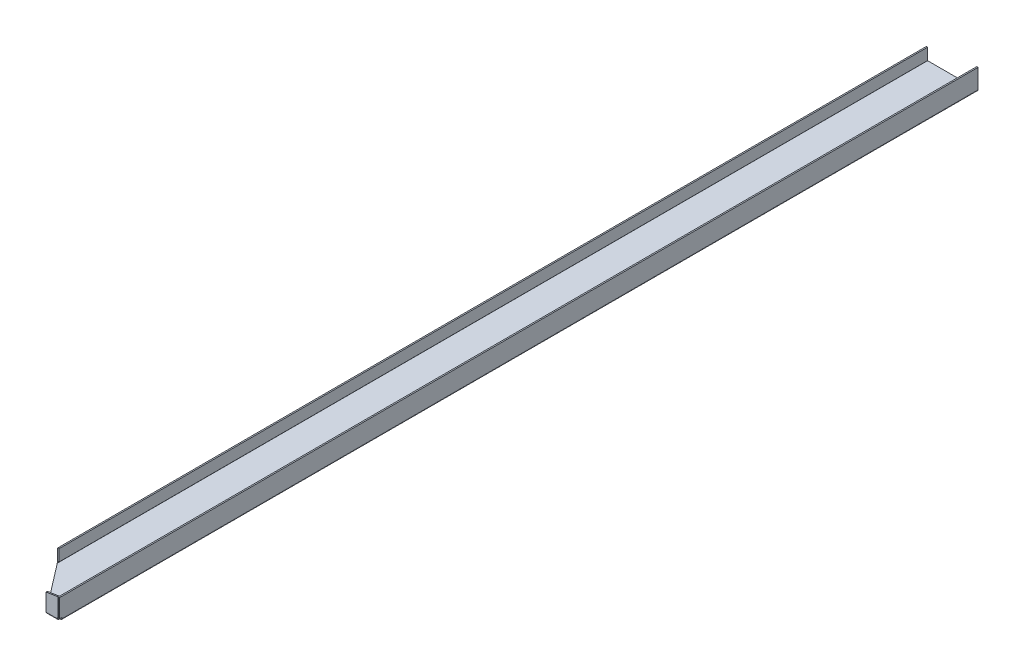
ISO-10303-21;
HEADER;
FILE_DESCRIPTION(('STEP AP214'),'2;1');
FILE_NAME('part.step','',(''),(''),'','','');
FILE_SCHEMA(('AUTOMOTIVE_DESIGN { 1 0 10303 214 1 1 1 1 }'));
ENDSEC;
DATA;
#1=APPLICATION_CONTEXT('core data for automotive mechanical design processes');
#2=APPLICATION_PROTOCOL_DEFINITION('international standard','automotive_design',2000,#1);
#3=PRODUCT_CONTEXT('',#1,'mechanical');
#4=PRODUCT('Part','Part','',(#3));
#5=PRODUCT_RELATED_PRODUCT_CATEGORY('part','',(#4));
#6=PRODUCT_DEFINITION_FORMATION('','',#4);
#7=PRODUCT_DEFINITION_CONTEXT('part definition',#1,'design');
#8=PRODUCT_DEFINITION('design','',#6,#7);
#9=PRODUCT_DEFINITION_SHAPE('','',#8);
#10=(LENGTH_UNIT() NAMED_UNIT(*) SI_UNIT(.MILLI.,.METRE.));
#11=(NAMED_UNIT(*) PLANE_ANGLE_UNIT() SI_UNIT($,.RADIAN.));
#12=(NAMED_UNIT(*) SI_UNIT($,.STERADIAN.) SOLID_ANGLE_UNIT());
#13=UNCERTAINTY_MEASURE_WITH_UNIT(LENGTH_MEASURE(1.E-05),#10,'distance_accuracy_value','');
#14=(GEOMETRIC_REPRESENTATION_CONTEXT(3) GLOBAL_UNCERTAINTY_ASSIGNED_CONTEXT((#13)) GLOBAL_UNIT_ASSIGNED_CONTEXT((#10,
#11,#12)) REPRESENTATION_CONTEXT('',''));
#15=CARTESIAN_POINT('',(0.,0.,0.));
#16=DIRECTION('',(0.,0.,1.));
#17=DIRECTION('',(1.,0.,0.));
#18=AXIS2_PLACEMENT_3D('',#15,#16,#17);
#19=CARTESIAN_POINT('',(137.6,-94.9521229518905,410.229299937073));
#20=DIRECTION('',(1.,0.,0.));
#21=DIRECTION('',(0.,-1.,0.));
#22=AXIS2_PLACEMENT_3D('',#19,#20,#21);
#23=PLANE('',#22);
#24=DIRECTION('',(0.,1.,0.));
#25=VECTOR('',#24,1.);
#26=CARTESIAN_POINT('',(137.6,-115.982008995502,480.));
#27=LINE('',#26,#25);
#28=CARTESIAN_POINT('',(137.6,-144.476011994003,480.));
#29=VERTEX_POINT('',#28);
#30=CARTESIAN_POINT('',(137.6,-116.341829085457,480.));
#31=VERTEX_POINT('',#30);
#32=EDGE_CURVE('E100',#29,#31,#27,.T.);
#33=ORIENTED_EDGE('',*,*,#32,.F.);
#34=DIRECTION('',(0.,0.,1.));
#35=VECTOR('',#34,1.);
#36=CARTESIAN_POINT('',(137.6,-144.476011994003,410.229299937073));
#37=LINE('',#36,#35);
#38=CARTESIAN_POINT('',(137.6,-144.476011994003,478.));
#39=VERTEX_POINT('',#38);
#40=EDGE_CURVE('E330',#39,#29,#37,.T.);
#41=ORIENTED_EDGE('',*,*,#40,.F.);
#42=DIRECTION('',(0.,1.,0.));
#43=VECTOR('',#42,1.);
#44=CARTESIAN_POINT('',(137.6,-94.9521229518905,478.));
#45=LINE('',#44,#43);
#46=CARTESIAN_POINT('',(137.6,-116.341829085457,478.));
#47=VERTEX_POINT('',#46);
#48=EDGE_CURVE('E336',#39,#47,#45,.T.);
#49=ORIENTED_EDGE('',*,*,#48,.T.);
#50=DIRECTION('',(0.,0.,1.));
#51=VECTOR('',#50,1.);
#52=CARTESIAN_POINT('',(137.6,-116.341829085457,410.229299937073));
#53=LINE('',#52,#51);
#54=EDGE_CURVE('E332',#47,#31,#53,.T.);
#55=ORIENTED_EDGE('',*,*,#54,.T.);
#56=EDGE_LOOP('',(#33,#41,#49,#55));
#57=FACE_BOUND('',#56,.T.);
#58=ADVANCED_FACE('F47',(#57),#23,.T.);
#59=CARTESIAN_POINT('',(140.,-144.476011994003,410.229299937073));
#60=DIRECTION('',(0.,-1.,0.));
#61=DIRECTION('',(0.,0.,-1.));
#62=AXIS2_PLACEMENT_3D('',#59,#60,#61);
#63=PLANE('',#62);
#64=DIRECTION('',(-1.,0.,0.));
#65=VECTOR('',#64,1.);
#66=CARTESIAN_POINT('',(140.,-144.476011994003,480.));
#67=LINE('',#66,#65);
#68=CARTESIAN_POINT('',(136.5,-144.476011994003,480.));
#69=VERTEX_POINT('',#68);
#70=EDGE_CURVE('E329',#29,#69,#67,.T.);
#71=ORIENTED_EDGE('',*,*,#70,.T.);
#72=DIRECTION('',(0.,0.,1.));
#73=VECTOR('',#72,1.);
#74=CARTESIAN_POINT('',(136.5,-144.476011994003,410.229299937073));
#75=LINE('',#74,#73);
#76=CARTESIAN_POINT('',(136.5,-144.476011994003,478.));
#77=VERTEX_POINT('',#76);
#78=EDGE_CURVE('E58',#77,#69,#75,.T.);
#79=ORIENTED_EDGE('',*,*,#78,.F.);
#80=DIRECTION('',(1.,0.,0.));
#81=VECTOR('',#80,1.);
#82=CARTESIAN_POINT('',(140.,-144.476011994003,478.));
#83=LINE('',#82,#81);
#84=EDGE_CURVE('E67',#77,#39,#83,.T.);
#85=ORIENTED_EDGE('',*,*,#84,.T.);
#86=ORIENTED_EDGE('',*,*,#40,.T.);
#87=EDGE_LOOP('',(#71,#79,#85,#86));
#88=FACE_BOUND('',#87,.T.);
#89=ADVANCED_FACE('F327',(#88),#63,.T.);
#90=CARTESIAN_POINT('',(143.083594897016,-115.51970091499,410.229299937073));
#91=DIRECTION('',(0.148267949866615,-0.988947225610321,0.));
#92=DIRECTION('',(-0.988947225610321,-0.148267949866615,0.));
#93=AXIS2_PLACEMENT_3D('',#90,#91,#92);
#94=PLANE('',#93);
#95=DIRECTION('',(0.,0.,1.));
#96=VECTOR('',#95,1.);
#97=CARTESIAN_POINT('',(119.0333716916,-119.125431530495,410.229299937073));
#98=LINE('',#97,#96);
#99=CARTESIAN_POINT('',(119.0333716916,-119.125431530495,478.));
#100=VERTEX_POINT('',#99);
#101=CARTESIAN_POINT('',(119.0333716916,-119.125431530495,480.));
#102=VERTEX_POINT('',#101);
#103=EDGE_CURVE('E362',#100,#102,#98,.T.);
#104=ORIENTED_EDGE('',*,*,#103,.T.);
#105=DIRECTION('',(-0.988947225610321,-0.148267949866615,0.));
#106=VECTOR('',#105,1.);
#107=CARTESIAN_POINT('',(143.083594897016,-115.51970091499,480.));
#108=LINE('',#107,#106);
#109=EDGE_CURVE('E93',#31,#102,#108,.T.);
#110=ORIENTED_EDGE('',*,*,#109,.F.);
#111=ORIENTED_EDGE('',*,*,#54,.F.);
#112=DIRECTION('',(0.988947225610321,0.148267949866615,0.));
#113=VECTOR('',#112,1.);
#114=CARTESIAN_POINT('',(143.083594897016,-115.51970091499,478.));
#115=LINE('',#114,#113);
#116=EDGE_CURVE('E12',#100,#47,#115,.T.);
#117=ORIENTED_EDGE('',*,*,#116,.F.);
#118=EDGE_LOOP('',(#104,#110,#111,#117));
#119=FACE_BOUND('',#118,.T.);
#120=ADVANCED_FACE('F366',(#119),#94,.F.);
#121=CARTESIAN_POINT('',(119.0333716916,-115.982008995502,410.229299937073));
#122=DIRECTION('',(-1.,0.,0.));
#123=DIRECTION('',(0.,1.,0.));
#124=AXIS2_PLACEMENT_3D('',#121,#122,#123);
#125=PLANE('',#124);
#126=DIRECTION('',(0.,-1.,0.));
#127=VECTOR('',#126,1.);
#128=CARTESIAN_POINT('',(119.0333716916,-115.982008995502,480.));
#129=LINE('',#128,#127);
#130=CARTESIAN_POINT('',(119.0333716916,-145.876011994003,480.));
#131=VERTEX_POINT('',#130);
#132=EDGE_CURVE('E252',#102,#131,#129,.T.);
#133=ORIENTED_EDGE('',*,*,#132,.F.);
#134=ORIENTED_EDGE('',*,*,#103,.F.);
#135=DIRECTION('',(0.,-1.,0.));
#136=VECTOR('',#135,1.);
#137=CARTESIAN_POINT('',(119.0333716916,-115.982008995502,478.));
#138=LINE('',#137,#136);
#139=CARTESIAN_POINT('',(119.0333716916,-145.876011994003,478.));
#140=VERTEX_POINT('',#139);
#141=EDGE_CURVE('E274',#100,#140,#138,.T.);
#142=ORIENTED_EDGE('',*,*,#141,.T.);
#143=CARTESIAN_POINT('',(119.0333716916,-145.876011994003,480.));
#144=CARTESIAN_POINT('',(119.0333716916,-145.876011994003,478.));
#145=B_SPLINE_CURVE_WITH_KNOTS('',1,(#143,#144),.UNSPECIFIED.,.F.,.F.,(2,2),(0.,1.),.UNSPECIFIED.);
#146=EDGE_CURVE('E260',#140,#131,#145,.F.);
#147=ORIENTED_EDGE('',*,*,#146,.T.);
#148=EDGE_LOOP('',(#133,#134,#142,#147));
#149=FACE_BOUND('',#148,.T.);
#150=ADVANCED_FACE('F272',(#149),#125,.T.);
#151=CARTESIAN_POINT('',(140.,-115.982008995502,480.));
#152=DIRECTION('',(0.,0.,-1.));
#153=DIRECTION('',(-1.,0.,0.));
#154=AXIS2_PLACEMENT_3D('',#151,#152,#153);
#155=PLANE('',#154);
#156=ORIENTED_EDGE('',*,*,#132,.T.);
#157=DIRECTION('',(1.,0.,0.));
#158=VECTOR('',#157,1.);
#159=CARTESIAN_POINT('',(119.0333716916,-145.876011994003,480.));
#160=LINE('',#159,#158);
#161=CARTESIAN_POINT('',(136.5,-145.876011994003,480.));
#162=VERTEX_POINT('',#161);
#163=EDGE_CURVE('E238',#131,#162,#160,.T.);
#164=ORIENTED_EDGE('',*,*,#163,.T.);
#165=DIRECTION('',(0.,-1.,0.));
#166=VECTOR('',#165,1.);
#167=CARTESIAN_POINT('',(136.5,-144.476011994003,480.));
#168=LINE('',#167,#166);
#169=EDGE_CURVE('E294',#69,#162,#168,.T.);
#170=ORIENTED_EDGE('',*,*,#169,.F.);
#171=ORIENTED_EDGE('',*,*,#70,.F.);
#172=ORIENTED_EDGE('',*,*,#32,.T.);
#173=ORIENTED_EDGE('',*,*,#109,.T.);
#174=EDGE_LOOP('',(#156,#164,#170,#171,#172,#173));
#175=FACE_BOUND('',#174,.T.);
#176=ADVANCED_FACE('F278',(#175),#155,.F.);
#177=CARTESIAN_POINT('',(136.5,-94.9521229518905,410.229299937073));
#178=DIRECTION('',(1.,0.,0.));
#179=DIRECTION('',(0.,-1.,0.));
#180=AXIS2_PLACEMENT_3D('',#177,#178,#179);
#181=PLANE('',#180);
#182=ORIENTED_EDGE('',*,*,#169,.T.);
#183=DIRECTION('',(0.,0.,1.));
#184=VECTOR('',#183,1.);
#185=CARTESIAN_POINT('',(136.5,-145.876011994003,410.229299937073));
#186=LINE('',#185,#184);
#187=CARTESIAN_POINT('',(136.5,-145.876011994003,478.));
#188=VERTEX_POINT('',#187);
#189=EDGE_CURVE('E324',#188,#162,#186,.T.);
#190=ORIENTED_EDGE('',*,*,#189,.F.);
#191=DIRECTION('',(0.,1.,0.));
#192=VECTOR('',#191,1.);
#193=CARTESIAN_POINT('',(136.5,-94.9521229518905,478.));
#194=LINE('',#193,#192);
#195=EDGE_CURVE('E298',#188,#77,#194,.T.);
#196=ORIENTED_EDGE('',*,*,#195,.T.);
#197=ORIENTED_EDGE('',*,*,#78,.T.);
#198=EDGE_LOOP('',(#182,#190,#196,#197));
#199=FACE_BOUND('',#198,.T.);
#200=ADVANCED_FACE('F323',(#199),#181,.T.);
#201=CARTESIAN_POINT('',(140.,-94.9521229518905,478.));
#202=DIRECTION('',(0.,0.,-1.));
#203=DIRECTION('',(-1.,0.,0.));
#204=AXIS2_PLACEMENT_3D('',#201,#202,#203);
#205=PLANE('',#204);
#206=DIRECTION('',(1.,0.,0.));
#207=VECTOR('',#206,1.);
#208=CARTESIAN_POINT('',(119.0333716916,-145.876011994003,478.));
#209=LINE('',#208,#207);
#210=EDGE_CURVE('E346',#140,#188,#209,.T.);
#211=ORIENTED_EDGE('',*,*,#210,.F.);
#212=ORIENTED_EDGE('',*,*,#141,.F.);
#213=ORIENTED_EDGE('',*,*,#116,.T.);
#214=ORIENTED_EDGE('',*,*,#48,.F.);
#215=ORIENTED_EDGE('',*,*,#84,.F.);
#216=ORIENTED_EDGE('',*,*,#195,.F.);
#217=EDGE_LOOP('',(#211,#212,#213,#214,#215,#216));
#218=FACE_BOUND('',#217,.T.);
#219=ADVANCED_FACE('F49',(#218),#205,.T.);
#220=CARTESIAN_POINT('',(2746.41546304984,-127.976011994,560.));
#221=DIRECTION('',(0.,1.,0.));
#222=DIRECTION('',(-1.,0.,0.));
#223=AXIS2_PLACEMENT_3D('',#220,#221,#222);
#224=PLANE('',#223);
#225=DIRECTION('',(-1.,0.,0.));
#226=VECTOR('',#225,1.);
#227=CARTESIAN_POINT('',(2746.41546304984,-127.976011994,-940.));
#228=LINE('',#227,#226);
#229=CARTESIAN_POINT('',(61.9999999999999,-127.976011994003,-940.));
#230=VERTEX_POINT('',#229);
#231=CARTESIAN_POINT('',(60.,-127.976011994003,-940.));
#232=VERTEX_POINT('',#231);
#233=EDGE_CURVE('E806',#230,#232,#228,.T.);
#234=ORIENTED_EDGE('',*,*,#233,.T.);
#235=DIRECTION('',(0.,0.,-1.));
#236=VECTOR('',#235,1.);
#237=CARTESIAN_POINT('',(59.9999999999999,-127.976011994003,560.));
#238=LINE('',#237,#236);
#239=CARTESIAN_POINT('',(59.9999999999999,-127.976011994003,403.088455772113));
#240=VERTEX_POINT('',#239);
#241=EDGE_CURVE('E745',#240,#232,#238,.T.);
#242=ORIENTED_EDGE('',*,*,#241,.F.);
#243=DIRECTION('',(-1.,0.,0.));
#244=VECTOR('',#243,1.);
#245=CARTESIAN_POINT('',(2746.41546304984,-127.976011994,403.088455772113));
#246=LINE('',#245,#244);
#247=CARTESIAN_POINT('',(61.9999999999998,-127.976011994003,403.088455772113));
#248=VERTEX_POINT('',#247);
#249=EDGE_CURVE('E424',#248,#240,#246,.T.);
#250=ORIENTED_EDGE('',*,*,#249,.F.);
#251=DIRECTION('',(0.,0.,-1.));
#252=VECTOR('',#251,1.);
#253=CARTESIAN_POINT('',(61.9999999999999,-127.976011994003,560.));
#254=LINE('',#253,#252);
#255=EDGE_CURVE('E109',#248,#230,#254,.T.);
#256=ORIENTED_EDGE('',*,*,#255,.T.);
#257=EDGE_LOOP('',(#234,#242,#250,#256));
#258=FACE_BOUND('',#257,.T.);
#259=ADVANCED_FACE('F387',(#258),#224,.T.);
#260=CARTESIAN_POINT('',(2746.41546304984,-147.976011994,-940.));
#261=DIRECTION('',(0.,0.,1.));
#262=DIRECTION('',(0.,-1.,0.));
#263=AXIS2_PLACEMENT_3D('',#260,#261,#262);
#264=PLANE('',#263);
#265=DIRECTION('',(0.,1.,0.));
#266=VECTOR('',#265,1.);
#267=CARTESIAN_POINT('',(60.,-147.976011994003,-940.));
#268=LINE('',#267,#266);
#269=CARTESIAN_POINT('',(60.,-145.876011994004,-940.));
#270=VERTEX_POINT('',#269);
#271=EDGE_CURVE('E746',#270,#232,#268,.T.);
#272=ORIENTED_EDGE('',*,*,#271,.T.);
#273=ORIENTED_EDGE('',*,*,#233,.F.);
#274=DIRECTION('',(0.,1.,0.));
#275=VECTOR('',#274,1.);
#276=CARTESIAN_POINT('',(62.,-147.976011994003,-940.));
#277=LINE('',#276,#275);
#278=CARTESIAN_POINT('',(62.,-145.876011994003,-940.));
#279=VERTEX_POINT('',#278);
#280=EDGE_CURVE('E350',#279,#230,#277,.T.);
#281=ORIENTED_EDGE('',*,*,#280,.F.);
#282=DIRECTION('',(-1.,0.,0.));
#283=VECTOR('',#282,1.);
#284=CARTESIAN_POINT('',(2746.41546304984,-145.876011994,-940.));
#285=LINE('',#284,#283);
#286=EDGE_CURVE('E743',#279,#270,#285,.T.);
#287=ORIENTED_EDGE('',*,*,#286,.T.);
#288=EDGE_LOOP('',(#272,#273,#281,#287));
#289=FACE_BOUND('',#288,.T.);
#290=ADVANCED_FACE('F391',(#289),#264,.F.);
#291=CARTESIAN_POINT('',(60.,-147.976011994003,560.));
#292=DIRECTION('',(-1.,0.,0.));
#293=DIRECTION('',(0.,-1.,0.));
#294=AXIS2_PLACEMENT_3D('',#291,#292,#293);
#295=PLANE('',#294);
#296=DIRECTION('',(0.,0.,-1.));
#297=VECTOR('',#296,1.);
#298=CARTESIAN_POINT('',(60.,-145.876011994003,-940.));
#299=LINE('',#298,#297);
#300=CARTESIAN_POINT('',(60.,-145.876011994003,403.088455772113));
#301=VERTEX_POINT('',#300);
#302=EDGE_CURVE('E700',#301,#270,#299,.T.);
#303=ORIENTED_EDGE('',*,*,#302,.F.);
#304=DIRECTION('',(0.,-1.,0.));
#305=VECTOR('',#304,1.);
#306=CARTESIAN_POINT('',(60.,-115.982008995502,403.088455772113));
#307=LINE('',#306,#305);
#308=EDGE_CURVE('E751',#240,#301,#307,.T.);
#309=ORIENTED_EDGE('',*,*,#308,.F.);
#310=ORIENTED_EDGE('',*,*,#241,.T.);
#311=ORIENTED_EDGE('',*,*,#271,.F.);
#312=EDGE_LOOP('',(#303,#309,#310,#311));
#313=FACE_BOUND('',#312,.T.);
#314=ADVANCED_FACE('F397',(#313),#295,.T.);
#315=CARTESIAN_POINT('',(2746.41546304984,-115.9820089955,403.088455772113));
#316=DIRECTION('',(0.,0.,-1.));
#317=DIRECTION('',(0.,1.,0.));
#318=AXIS2_PLACEMENT_3D('',#315,#316,#317);
#319=PLANE('',#318);
#320=ORIENTED_EDGE('',*,*,#308,.T.);
#321=CARTESIAN_POINT('',(62.,-145.876011994003,403.088455772114));
#322=CARTESIAN_POINT('',(60.,-145.876011994003,403.088455772114));
#323=B_SPLINE_CURVE_WITH_KNOTS('',1,(#321,#322),.UNSPECIFIED.,.F.,.F.,(2,2),(0.,1.),.UNSPECIFIED.);
#324=CARTESIAN_POINT('',(62.,-145.876011994003,403.088455772113));
#325=VERTEX_POINT('',#324);
#326=EDGE_CURVE('E584',#325,#301,#323,.T.);
#327=ORIENTED_EDGE('',*,*,#326,.F.);
#328=DIRECTION('',(0.,1.,0.));
#329=VECTOR('',#328,1.);
#330=CARTESIAN_POINT('',(61.9999999999998,-115.982008995502,403.088455772113));
#331=LINE('',#330,#329);
#332=EDGE_CURVE('E126',#325,#248,#331,.T.);
#333=ORIENTED_EDGE('',*,*,#332,.T.);
#334=ORIENTED_EDGE('',*,*,#249,.T.);
#335=EDGE_LOOP('',(#320,#327,#333,#334));
#336=FACE_BOUND('',#335,.T.);
#337=ADVANCED_FACE('F406',(#336),#319,.F.);
#338=CARTESIAN_POINT('',(62.,-147.976011994003,560.));
#339=DIRECTION('',(-1.,0.,0.));
#340=DIRECTION('',(0.,-1.,0.));
#341=AXIS2_PLACEMENT_3D('',#338,#339,#340);
#342=PLANE('',#341);
#343=ORIENTED_EDGE('',*,*,#332,.F.);
#344=DIRECTION('',(0.,0.,-1.));
#345=VECTOR('',#344,1.);
#346=CARTESIAN_POINT('',(61.9999999999998,-145.876011994003,-940.));
#347=LINE('',#346,#345);
#348=EDGE_CURVE('E130',#325,#279,#347,.T.);
#349=ORIENTED_EDGE('',*,*,#348,.T.);
#350=ORIENTED_EDGE('',*,*,#280,.T.);
#351=ORIENTED_EDGE('',*,*,#255,.F.);
#352=EDGE_LOOP('',(#343,#349,#350,#351));
#353=FACE_BOUND('',#352,.T.);
#354=ADVANCED_FACE('F375',(#353),#342,.F.);
#355=CARTESIAN_POINT('',(-2700.62926226938,-115.982008995502,480.));
#356=DIRECTION('',(0.,0.,-1.));
#357=DIRECTION('',(0.,-1.,0.));
#358=AXIS2_PLACEMENT_3D('',#355,#356,#357);
#359=PLANE('',#358);
#360=DIRECTION('',(0.,-1.,0.));
#361=VECTOR('',#360,1.);
#362=CARTESIAN_POINT('',(140.,-115.982008995502,480.));
#363=LINE('',#362,#361);
#364=CARTESIAN_POINT('',(140.,-115.982008995502,480.));
#365=VERTEX_POINT('',#364);
#366=CARTESIAN_POINT('',(140.,-144.476011994003,480.));
#367=VERTEX_POINT('',#366);
#368=EDGE_CURVE('E778',#365,#367,#363,.T.);
#369=ORIENTED_EDGE('',*,*,#368,.F.);
#370=DIRECTION('',(1.,0.,0.));
#371=VECTOR('',#370,1.);
#372=CARTESIAN_POINT('',(-2700.62926226938,-115.982008995502,480.));
#373=LINE('',#372,#371);
#374=CARTESIAN_POINT('',(138.,-115.982008995502,480.));
#375=VERTEX_POINT('',#374);
#376=EDGE_CURVE('E827',#375,#365,#373,.T.);
#377=ORIENTED_EDGE('',*,*,#376,.F.);
#378=DIRECTION('',(0.,1.,0.));
#379=VECTOR('',#378,1.);
#380=CARTESIAN_POINT('',(138.,-115.982008995502,480.));
#381=LINE('',#380,#379);
#382=CARTESIAN_POINT('',(138.,-144.476011994003,480.));
#383=VERTEX_POINT('',#382);
#384=EDGE_CURVE('E585',#383,#375,#381,.T.);
#385=ORIENTED_EDGE('',*,*,#384,.F.);
#386=DIRECTION('',(1.,0.,0.));
#387=VECTOR('',#386,1.);
#388=CARTESIAN_POINT('',(-2700.62926226938,-144.476011994003,480.));
#389=LINE('',#388,#387);
#390=EDGE_CURVE('E834',#383,#367,#389,.T.);
#391=ORIENTED_EDGE('',*,*,#390,.T.);
#392=EDGE_LOOP('',(#369,#377,#385,#391));
#393=FACE_BOUND('',#392,.T.);
#394=ADVANCED_FACE('F891',(#393),#359,.F.);
#395=CARTESIAN_POINT('',(-2700.62926226938,-115.982008995502,560.));
#396=DIRECTION('',(0.,-1.,0.));
#397=DIRECTION('',(1.,0.,0.));
#398=AXIS2_PLACEMENT_3D('',#395,#396,#397);
#399=PLANE('',#398);
#400=DIRECTION('',(0.,0.,-1.));
#401=VECTOR('',#400,1.);
#402=CARTESIAN_POINT('',(140.,-115.982008995502,560.));
#403=LINE('',#402,#401);
#404=CARTESIAN_POINT('',(140.,-115.982008995502,-940.));
#405=VERTEX_POINT('',#404);
#406=EDGE_CURVE('E830',#365,#405,#403,.T.);
#407=ORIENTED_EDGE('',*,*,#406,.T.);
#408=DIRECTION('',(1.,0.,0.));
#409=VECTOR('',#408,1.);
#410=CARTESIAN_POINT('',(-2700.62926226938,-115.982008995502,-940.));
#411=LINE('',#410,#409);
#412=CARTESIAN_POINT('',(138.,-115.982008995502,-940.));
#413=VERTEX_POINT('',#412);
#414=EDGE_CURVE('E772',#413,#405,#411,.T.);
#415=ORIENTED_EDGE('',*,*,#414,.F.);
#416=DIRECTION('',(0.,0.,-1.));
#417=VECTOR('',#416,1.);
#418=CARTESIAN_POINT('',(138.,-115.982008995502,560.));
#419=LINE('',#418,#417);
#420=EDGE_CURVE('E139',#375,#413,#419,.T.);
#421=ORIENTED_EDGE('',*,*,#420,.F.);
#422=ORIENTED_EDGE('',*,*,#376,.T.);
#423=EDGE_LOOP('',(#407,#415,#421,#422));
#424=FACE_BOUND('',#423,.T.);
#425=ADVANCED_FACE('F1031',(#424),#399,.F.);
#426=CARTESIAN_POINT('',(-2700.62926226938,-144.476011994003,560.));
#427=DIRECTION('',(0.,1.,0.));
#428=DIRECTION('',(-1.,0.,0.));
#429=AXIS2_PLACEMENT_3D('',#426,#427,#428);
#430=PLANE('',#429);
#431=DIRECTION('',(0.,0.,1.));
#432=VECTOR('',#431,1.);
#433=CARTESIAN_POINT('',(140.,-144.476011994003,480.));
#434=LINE('',#433,#432);
#435=CARTESIAN_POINT('',(140.,-144.476011994003,476.5));
#436=VERTEX_POINT('',#435);
#437=EDGE_CURVE('E824',#436,#367,#434,.T.);
#438=ORIENTED_EDGE('',*,*,#437,.T.);
#439=ORIENTED_EDGE('',*,*,#390,.F.);
#440=DIRECTION('',(0.,0.,1.));
#441=VECTOR('',#440,1.);
#442=CARTESIAN_POINT('',(138.,-144.476011994003,560.));
#443=LINE('',#442,#441);
#444=CARTESIAN_POINT('',(138.,-144.476011994003,476.5));
#445=VERTEX_POINT('',#444);
#446=EDGE_CURVE('E795',#445,#383,#443,.T.);
#447=ORIENTED_EDGE('',*,*,#446,.F.);
#448=DIRECTION('',(1.,0.,0.));
#449=VECTOR('',#448,1.);
#450=CARTESIAN_POINT('',(-2700.62926226938,-144.476011994003,476.5));
#451=LINE('',#450,#449);
#452=EDGE_CURVE('E821',#445,#436,#451,.T.);
#453=ORIENTED_EDGE('',*,*,#452,.T.);
#454=EDGE_LOOP('',(#438,#439,#447,#453));
#455=FACE_BOUND('',#454,.T.);
#456=ADVANCED_FACE('F1040',(#455),#430,.F.);
#457=CARTESIAN_POINT('',(-2700.62926226938,-115.982008995502,476.5));
#458=DIRECTION('',(0.,0.,-1.));
#459=DIRECTION('',(0.,-1.,0.));
#460=AXIS2_PLACEMENT_3D('',#457,#458,#459);
#461=PLANE('',#460);
#462=DIRECTION('',(0.,-1.,0.));
#463=VECTOR('',#462,1.);
#464=CARTESIAN_POINT('',(140.,-144.476011994003,476.5));
#465=LINE('',#464,#463);
#466=CARTESIAN_POINT('',(140.,-145.876011994004,476.5));
#467=VERTEX_POINT('',#466);
#468=EDGE_CURVE('E773',#436,#467,#465,.T.);
#469=ORIENTED_EDGE('',*,*,#468,.F.);
#470=ORIENTED_EDGE('',*,*,#452,.F.);
#471=DIRECTION('',(0.,1.,0.));
#472=VECTOR('',#471,1.);
#473=CARTESIAN_POINT('',(138.,-115.982008995502,476.5));
#474=LINE('',#473,#472);
#475=CARTESIAN_POINT('',(138.,-145.876011994003,476.5));
#476=VERTEX_POINT('',#475);
#477=EDGE_CURVE('E791',#476,#445,#474,.T.);
#478=ORIENTED_EDGE('',*,*,#477,.F.);
#479=DIRECTION('',(1.,0.,0.));
#480=VECTOR('',#479,1.);
#481=CARTESIAN_POINT('',(-2700.62926226938,-145.876011994003,476.5));
#482=LINE('',#481,#480);
#483=EDGE_CURVE('E818',#476,#467,#482,.T.);
#484=ORIENTED_EDGE('',*,*,#483,.T.);
#485=EDGE_LOOP('',(#469,#470,#478,#484));
#486=FACE_BOUND('',#485,.T.);
#487=ADVANCED_FACE('F1049',(#486),#461,.F.);
#488=CARTESIAN_POINT('',(140.,-115.982008995502,560.));
#489=DIRECTION('',(1.,0.,0.));
#490=DIRECTION('',(0.,0.,-1.));
#491=AXIS2_PLACEMENT_3D('',#488,#489,#490);
#492=PLANE('',#491);
#493=DIRECTION('',(0.,0.,1.));
#494=VECTOR('',#493,1.);
#495=CARTESIAN_POINT('',(140.,-145.876011994003,476.5));
#496=LINE('',#495,#494);
#497=CARTESIAN_POINT('',(140.,-145.876011994003,-940.));
#498=VERTEX_POINT('',#497);
#499=EDGE_CURVE('E650',#498,#467,#496,.T.);
#500=ORIENTED_EDGE('',*,*,#499,.F.);
#501=DIRECTION('',(0.,-1.,0.));
#502=VECTOR('',#501,1.);
#503=CARTESIAN_POINT('',(140.,-115.982008995502,-940.));
#504=LINE('',#503,#502);
#505=EDGE_CURVE('E767',#405,#498,#504,.T.);
#506=ORIENTED_EDGE('',*,*,#505,.F.);
#507=ORIENTED_EDGE('',*,*,#406,.F.);
#508=ORIENTED_EDGE('',*,*,#368,.T.);
#509=ORIENTED_EDGE('',*,*,#437,.F.);
#510=ORIENTED_EDGE('',*,*,#468,.T.);
#511=EDGE_LOOP('',(#500,#506,#507,#508,#509,#510));
#512=FACE_BOUND('',#511,.T.);
#513=ADVANCED_FACE('F1059',(#512),#492,.T.);
#514=CARTESIAN_POINT('',(-2700.62926226938,-115.982008995502,-940.));
#515=DIRECTION('',(0.,0.,1.));
#516=DIRECTION('',(0.,1.,0.));
#517=AXIS2_PLACEMENT_3D('',#514,#515,#516);
#518=PLANE('',#517);
#519=ORIENTED_EDGE('',*,*,#505,.T.);
#520=DIRECTION('',(1.,0.,0.));
#521=VECTOR('',#520,1.);
#522=CARTESIAN_POINT('',(-2700.62926226938,-145.876011994003,-940.));
#523=LINE('',#522,#521);
#524=CARTESIAN_POINT('',(138.,-145.876011994003,-940.));
#525=VERTEX_POINT('',#524);
#526=EDGE_CURVE('E643',#525,#498,#523,.T.);
#527=ORIENTED_EDGE('',*,*,#526,.F.);
#528=DIRECTION('',(0.,1.,0.));
#529=VECTOR('',#528,1.);
#530=CARTESIAN_POINT('',(138.,-115.982008995502,-940.));
#531=LINE('',#530,#529);
#532=EDGE_CURVE('E168',#413,#525,#531,.F.);
#533=ORIENTED_EDGE('',*,*,#532,.F.);
#534=ORIENTED_EDGE('',*,*,#414,.T.);
#535=EDGE_LOOP('',(#519,#527,#533,#534));
#536=FACE_BOUND('',#535,.T.);
#537=ADVANCED_FACE('F959',(#536),#518,.F.);
#538=CARTESIAN_POINT('',(138.,-115.982008995502,560.));
#539=DIRECTION('',(1.,0.,0.));
#540=DIRECTION('',(0.,0.,-1.));
#541=AXIS2_PLACEMENT_3D('',#538,#539,#540);
#542=PLANE('',#541);
#543=ORIENTED_EDGE('',*,*,#532,.T.);
#544=DIRECTION('',(0.,0.,1.));
#545=VECTOR('',#544,1.);
#546=CARTESIAN_POINT('',(138.,-145.876011994003,476.5));
#547=LINE('',#546,#545);
#548=EDGE_CURVE('E171',#525,#476,#547,.T.);
#549=ORIENTED_EDGE('',*,*,#548,.T.);
#550=ORIENTED_EDGE('',*,*,#477,.T.);
#551=ORIENTED_EDGE('',*,*,#446,.T.);
#552=ORIENTED_EDGE('',*,*,#384,.T.);
#553=ORIENTED_EDGE('',*,*,#420,.T.);
#554=EDGE_LOOP('',(#543,#549,#550,#551,#552,#553));
#555=FACE_BOUND('',#554,.T.);
#556=ADVANCED_FACE('F402',(#555),#542,.F.);
#557=CARTESIAN_POINT('',(165.44615641015,2691.87331499502,540.468830465397));
#558=DIRECTION('',(0.793268311202313,0.,-0.608872225054018));
#559=DIRECTION('',(-0.608872225054018,0.,-0.793268311202313));
#560=AXIS2_PLACEMENT_3D('',#557,#558,#559);
#561=PLANE('',#560);
#562=DIRECTION('',(0.608872225054018,0.,0.793268311202313));
#563=VECTOR('',#562,1.);
#564=CARTESIAN_POINT('',(119.0333716916,-147.976011994003,480.));
#565=LINE('',#564,#563);
#566=CARTESIAN_POINT('',(62.0999999999999,-147.976011994003,405.824437781109));
#567=VERTEX_POINT('',#566);
#568=CARTESIAN_POINT('',(117.421518987342,-147.976011994003,477.9));
#569=VERTEX_POINT('',#568);
#570=EDGE_CURVE('E600',#567,#569,#565,.T.);
#571=ORIENTED_EDGE('',*,*,#570,.T.);
#572=CARTESIAN_POINT('',(117.421518987342,-145.976011994003,477.9));
#573=CARTESIAN_POINT('',(117.421518987342,-147.976011994003,477.9));
#574=B_SPLINE_CURVE_WITH_KNOTS('',1,(#572,#573),.UNSPECIFIED.,.F.,.F.,(2,2),(0.,1.),.UNSPECIFIED.);
#575=CARTESIAN_POINT('',(117.421518987342,-145.976011994003,477.9));
#576=VERTEX_POINT('',#575);
#577=EDGE_CURVE('E263',#576,#569,#574,.T.);
#578=ORIENTED_EDGE('',*,*,#577,.F.);
#579=DIRECTION('',(0.608872225054018,0.,0.793268311202313));
#580=VECTOR('',#579,1.);
#581=CARTESIAN_POINT('',(165.44615641015,-145.976011994003,540.468830465397));
#582=LINE('',#581,#580);
#583=CARTESIAN_POINT('',(62.0999999999999,-145.976011994003,405.824437781109));
#584=VERTEX_POINT('',#583);
#585=EDGE_CURVE('E516',#584,#576,#582,.T.);
#586=ORIENTED_EDGE('',*,*,#585,.F.);
#587=CARTESIAN_POINT('',(62.0999999999996,-147.976011994003,405.824437781109));
#588=CARTESIAN_POINT('',(62.0999999999999,-145.976011994003,405.824437781109));
#589=B_SPLINE_CURVE_WITH_KNOTS('',1,(#587,#588),.UNSPECIFIED.,.F.,.F.,(2,2),(0.,1.),.UNSPECIFIED.);
#590=EDGE_CURVE('E488',#584,#567,#589,.F.);
#591=ORIENTED_EDGE('',*,*,#590,.T.);
#592=EDGE_LOOP('',(#571,#578,#586,#591));
#593=FACE_BOUND('',#592,.T.);
#594=ADVANCED_FACE('F630',(#593),#561,.F.);
#595=CARTESIAN_POINT('',(136.5,2691.87331499502,560.));
#596=DIRECTION('',(-1.,0.,0.));
#597=DIRECTION('',(0.,0.,1.));
#598=AXIS2_PLACEMENT_3D('',#595,#596,#597);
#599=PLANE('',#598);
#600=DIRECTION('',(0.,0.,-1.));
#601=VECTOR('',#600,1.);
#602=CARTESIAN_POINT('',(136.5,-147.976011994003,480.));
#603=LINE('',#602,#601);
#604=CARTESIAN_POINT('',(136.5,-147.976011994003,477.9));
#605=VERTEX_POINT('',#604);
#606=CARTESIAN_POINT('',(136.5,-147.976011994003,476.5));
#607=VERTEX_POINT('',#606);
#608=EDGE_CURVE('E183',#605,#607,#603,.T.);
#609=ORIENTED_EDGE('',*,*,#608,.T.);
#610=DIRECTION('',(0.,-1.,0.));
#611=VECTOR('',#610,1.);
#612=CARTESIAN_POINT('',(136.5,2691.87331499502,476.5));
#613=LINE('',#612,#611);
#614=CARTESIAN_POINT('',(136.5,-145.976011994003,476.5));
#615=VERTEX_POINT('',#614);
#616=EDGE_CURVE('E573',#615,#607,#613,.T.);
#617=ORIENTED_EDGE('',*,*,#616,.F.);
#618=DIRECTION('',(0.,0.,-1.));
#619=VECTOR('',#618,1.);
#620=CARTESIAN_POINT('',(136.5,-145.976011994003,560.));
#621=LINE('',#620,#619);
#622=CARTESIAN_POINT('',(136.5,-145.976011994003,477.9));
#623=VERTEX_POINT('',#622);
#624=EDGE_CURVE('E624',#623,#615,#621,.T.);
#625=ORIENTED_EDGE('',*,*,#624,.F.);
#626=DIRECTION('',(0.,-1.,0.));
#627=VECTOR('',#626,1.);
#628=CARTESIAN_POINT('',(136.5,2691.87331499502,477.9));
#629=LINE('',#628,#627);
#630=EDGE_CURVE('E179',#623,#605,#629,.T.);
#631=ORIENTED_EDGE('',*,*,#630,.T.);
#632=EDGE_LOOP('',(#609,#617,#625,#631));
#633=FACE_BOUND('',#632,.T.);
#634=ADVANCED_FACE('F879',(#633),#599,.F.);
#635=CARTESIAN_POINT('',(140.,2691.87331499502,476.5));
#636=DIRECTION('',(0.,0.,-1.));
#637=DIRECTION('',(-1.,0.,0.));
#638=AXIS2_PLACEMENT_3D('',#635,#636,#637);
#639=PLANE('',#638);
#640=DIRECTION('',(1.,0.,0.));
#641=VECTOR('',#640,1.);
#642=CARTESIAN_POINT('',(140.,-147.976011994003,476.5));
#643=LINE('',#642,#641);
#644=CARTESIAN_POINT('',(137.9,-147.976011994003,476.5));
#645=VERTEX_POINT('',#644);
#646=EDGE_CURVE('E601',#607,#645,#643,.T.);
#647=ORIENTED_EDGE('',*,*,#646,.T.);
#648=DIRECTION('',(0.,-1.,0.));
#649=VECTOR('',#648,1.);
#650=CARTESIAN_POINT('',(137.9,2691.87331499502,476.5));
#651=LINE('',#650,#649);
#652=CARTESIAN_POINT('',(137.9,-145.976011994003,476.5));
#653=VERTEX_POINT('',#652);
#654=EDGE_CURVE('E577',#653,#645,#651,.T.);
#655=ORIENTED_EDGE('',*,*,#654,.F.);
#656=DIRECTION('',(1.,0.,0.));
#657=VECTOR('',#656,1.);
#658=CARTESIAN_POINT('',(140.,-145.976011994003,476.5));
#659=LINE('',#658,#657);
#660=EDGE_CURVE('E872',#615,#653,#659,.T.);
#661=ORIENTED_EDGE('',*,*,#660,.F.);
#662=ORIENTED_EDGE('',*,*,#616,.T.);
#663=EDGE_LOOP('',(#647,#655,#661,#662));
#664=FACE_BOUND('',#663,.T.);
#665=ADVANCED_FACE('F877',(#664),#639,.F.);
#666=CARTESIAN_POINT('',(140.,2691.87331499502,-940.));
#667=DIRECTION('',(0.,0.,1.));
#668=DIRECTION('',(1.,0.,0.));
#669=AXIS2_PLACEMENT_3D('',#666,#667,#668);
#670=PLANE('',#669);
#671=DIRECTION('',(-1.,0.,0.));
#672=VECTOR('',#671,1.);
#673=CARTESIAN_POINT('',(140.,-147.976011994003,-940.));
#674=LINE('',#673,#672);
#675=CARTESIAN_POINT('',(137.9,-147.976011994003,-940.));
#676=VERTEX_POINT('',#675);
#677=CARTESIAN_POINT('',(62.1,-147.976011994003,-940.));
#678=VERTEX_POINT('',#677);
#679=EDGE_CURVE('E604',#676,#678,#674,.T.);
#680=ORIENTED_EDGE('',*,*,#679,.T.);
#681=DIRECTION('',(0.,-1.,0.));
#682=VECTOR('',#681,1.);
#683=CARTESIAN_POINT('',(62.1,2691.87331499502,-940.));
#684=LINE('',#683,#682);
#685=CARTESIAN_POINT('',(62.1,-145.976011994003,-940.));
#686=VERTEX_POINT('',#685);
#687=EDGE_CURVE('E741',#686,#678,#684,.T.);
#688=ORIENTED_EDGE('',*,*,#687,.F.);
#689=DIRECTION('',(-1.,0.,0.));
#690=VECTOR('',#689,1.);
#691=CARTESIAN_POINT('',(140.,-145.976011994003,-940.));
#692=LINE('',#691,#690);
#693=CARTESIAN_POINT('',(137.9,-145.976011994003,-940.));
#694=VERTEX_POINT('',#693);
#695=EDGE_CURVE('E522',#694,#686,#692,.T.);
#696=ORIENTED_EDGE('',*,*,#695,.F.);
#697=DIRECTION('',(0.,-1.,0.));
#698=VECTOR('',#697,1.);
#699=CARTESIAN_POINT('',(137.9,2691.87331499502,-940.));
#700=LINE('',#699,#698);
#701=EDGE_CURVE('E862',#694,#676,#700,.T.);
#702=ORIENTED_EDGE('',*,*,#701,.T.);
#703=EDGE_LOOP('',(#680,#688,#696,#702));
#704=FACE_BOUND('',#703,.T.);
#705=ADVANCED_FACE('F886',(#704),#670,.F.);
#706=CARTESIAN_POINT('',(140.,-145.976011994003,560.));
#707=DIRECTION('',(0.,-1.,0.));
#708=DIRECTION('',(0.,0.,-1.));
#709=AXIS2_PLACEMENT_3D('',#706,#707,#708);
#710=PLANE('',#709);
#711=DIRECTION('',(-1.,0.,0.));
#712=VECTOR('',#711,1.);
#713=CARTESIAN_POINT('',(117.421518987342,-145.976011994003,477.9));
#714=LINE('',#713,#712);
#715=EDGE_CURVE('E568',#623,#576,#714,.T.);
#716=ORIENTED_EDGE('',*,*,#715,.F.);
#717=ORIENTED_EDGE('',*,*,#624,.T.);
#718=ORIENTED_EDGE('',*,*,#660,.T.);
#719=DIRECTION('',(0.,0.,1.));
#720=VECTOR('',#719,1.);
#721=CARTESIAN_POINT('',(137.9,-145.976011994003,476.5));
#722=LINE('',#721,#720);
#723=EDGE_CURVE('E521',#694,#653,#722,.T.);
#724=ORIENTED_EDGE('',*,*,#723,.F.);
#725=ORIENTED_EDGE('',*,*,#695,.T.);
#726=DIRECTION('',(0.,0.,-1.));
#727=VECTOR('',#726,1.);
#728=CARTESIAN_POINT('',(62.1,-145.976011994003,-940.));
#729=LINE('',#728,#727);
#730=EDGE_CURVE('E514',#584,#686,#729,.T.);
#731=ORIENTED_EDGE('',*,*,#730,.F.);
#732=ORIENTED_EDGE('',*,*,#585,.T.);
#733=EDGE_LOOP('',(#716,#717,#718,#724,#725,#731,#732));
#734=FACE_BOUND('',#733,.T.);
#735=ADVANCED_FACE('F633',(#734),#710,.F.);
#736=CARTESIAN_POINT('',(140.,-147.976011994003,560.));
#737=DIRECTION('',(0.,-1.,0.));
#738=DIRECTION('',(0.,0.,-1.));
#739=AXIS2_PLACEMENT_3D('',#736,#737,#738);
#740=PLANE('',#739);
#741=ORIENTED_EDGE('',*,*,#608,.F.);
#742=DIRECTION('',(-1.,0.,0.));
#743=VECTOR('',#742,1.);
#744=CARTESIAN_POINT('',(117.421518987342,-147.976011994003,477.9));
#745=LINE('',#744,#743);
#746=EDGE_CURVE('E621',#605,#569,#745,.T.);
#747=ORIENTED_EDGE('',*,*,#746,.T.);
#748=ORIENTED_EDGE('',*,*,#570,.F.);
#749=DIRECTION('',(0.,0.,-1.));
#750=VECTOR('',#749,1.);
#751=CARTESIAN_POINT('',(62.1,-147.976011994003,-940.));
#752=LINE('',#751,#750);
#753=EDGE_CURVE('E641',#567,#678,#752,.T.);
#754=ORIENTED_EDGE('',*,*,#753,.T.);
#755=ORIENTED_EDGE('',*,*,#679,.F.);
#756=DIRECTION('',(0.,0.,1.));
#757=VECTOR('',#756,1.);
#758=CARTESIAN_POINT('',(137.9,-147.976011994003,476.5));
#759=LINE('',#758,#757);
#760=EDGE_CURVE('E609',#676,#645,#759,.T.);
#761=ORIENTED_EDGE('',*,*,#760,.T.);
#762=ORIENTED_EDGE('',*,*,#646,.F.);
#763=EDGE_LOOP('',(#741,#747,#748,#754,#755,#761,#762));
#764=FACE_BOUND('',#763,.T.);
#765=ADVANCED_FACE('F916',(#764),#740,.T.);
#766=CARTESIAN_POINT('',(137.9,-145.876011994003,476.5));
#767=DIRECTION('',(0.,0.,1.));
#768=DIRECTION('',(1.,0.,0.));
#769=AXIS2_PLACEMENT_3D('',#766,#767,#768);
#770=PLANE('',#769);
#771=ORIENTED_EDGE('',*,*,#483,.F.);
#772=CARTESIAN_POINT('',(137.9,-145.876011994003,476.5));
#773=DIRECTION('',(0.,0.,-1.));
#774=DIRECTION('',(-1.,0.,0.));
#775=AXIS2_PLACEMENT_3D('',#772,#773,#774);
#776=CIRCLE('',#775,0.10000000000001);
#777=EDGE_CURVE('E695',#476,#653,#776,.T.);
#778=ORIENTED_EDGE('',*,*,#777,.T.);
#779=ORIENTED_EDGE('',*,*,#654,.T.);
#780=CARTESIAN_POINT('',(137.9,-145.876011994003,476.5));
#781=DIRECTION('',(0.,0.,-1.));
#782=DIRECTION('',(-1.,0.,0.));
#783=AXIS2_PLACEMENT_3D('',#780,#781,#782);
#784=CIRCLE('',#783,2.10000000000001);
#785=EDGE_CURVE('E493',#467,#645,#784,.T.);
#786=ORIENTED_EDGE('',*,*,#785,.F.);
#787=EDGE_LOOP('',(#771,#778,#779,#786));
#788=FACE_BOUND('',#787,.T.);
#789=ADVANCED_FACE('F853',(#788),#770,.T.);
#790=CARTESIAN_POINT('',(137.9,-145.876011994003,-940.));
#791=DIRECTION('',(0.,0.,-1.));
#792=DIRECTION('',(-1.,0.,0.));
#793=AXIS2_PLACEMENT_3D('',#790,#791,#792);
#794=PLANE('',#793);
#795=CARTESIAN_POINT('',(137.9,-145.876011994003,-940.));
#796=DIRECTION('',(0.,0.,-1.));
#797=DIRECTION('',(-1.,0.,0.));
#798=AXIS2_PLACEMENT_3D('',#795,#796,#797);
#799=CIRCLE('',#798,0.10000000000001);
#800=EDGE_CURVE('E504',#694,#525,#799,.F.);
#801=ORIENTED_EDGE('',*,*,#800,.T.);
#802=ORIENTED_EDGE('',*,*,#526,.T.);
#803=CARTESIAN_POINT('',(137.9,-145.876011994003,-940.));
#804=DIRECTION('',(0.,0.,-1.));
#805=DIRECTION('',(-1.,0.,0.));
#806=AXIS2_PLACEMENT_3D('',#803,#804,#805);
#807=CIRCLE('',#806,2.10000000000001);
#808=EDGE_CURVE('E503',#676,#498,#807,.F.);
#809=ORIENTED_EDGE('',*,*,#808,.F.);
#810=ORIENTED_EDGE('',*,*,#701,.F.);
#811=EDGE_LOOP('',(#801,#802,#809,#810));
#812=FACE_BOUND('',#811,.T.);
#813=ADVANCED_FACE('F912',(#812),#794,.T.);
#814=CARTESIAN_POINT('',(137.9,-145.876011994003,1930.13674517796));
#815=DIRECTION('',(0.,0.,-1.));
#816=DIRECTION('',(-1.,0.,0.));
#817=AXIS2_PLACEMENT_3D('',#814,#815,#816);
#818=CYLINDRICAL_SURFACE('',#817,2.10000000000001);
#819=ORIENTED_EDGE('',*,*,#760,.F.);
#820=ORIENTED_EDGE('',*,*,#808,.T.);
#821=ORIENTED_EDGE('',*,*,#499,.T.);
#822=ORIENTED_EDGE('',*,*,#785,.T.);
#823=EDGE_LOOP('',(#819,#820,#821,#822));
#824=FACE_BOUND('',#823,.T.);
#825=ADVANCED_FACE('F464',(#824),#818,.T.);
#826=CARTESIAN_POINT('',(137.9,-145.876011994003,1930.13674517796));
#827=DIRECTION('',(0.,0.,-1.));
#828=DIRECTION('',(-1.,0.,0.));
#829=AXIS2_PLACEMENT_3D('',#826,#827,#828);
#830=CYLINDRICAL_SURFACE('',#829,0.10000000000001);
#831=ORIENTED_EDGE('',*,*,#723,.T.);
#832=ORIENTED_EDGE('',*,*,#777,.F.);
#833=ORIENTED_EDGE('',*,*,#548,.F.);
#834=ORIENTED_EDGE('',*,*,#800,.F.);
#835=EDGE_LOOP('',(#831,#832,#833,#834));
#836=FACE_BOUND('',#835,.T.);
#837=ADVANCED_FACE('F914',(#836),#830,.F.);
#838=CARTESIAN_POINT('',(62.1,-145.876011994003,-940.));
#839=DIRECTION('',(0.,0.,-1.));
#840=DIRECTION('',(-1.,0.,0.));
#841=AXIS2_PLACEMENT_3D('',#838,#839,#840);
#842=PLANE('',#841);
#843=ORIENTED_EDGE('',*,*,#286,.F.);
#844=CARTESIAN_POINT('',(62.1,-145.876011994003,-940.));
#845=DIRECTION('',(0.,0.,1.));
#846=DIRECTION('',(1.,0.,0.));
#847=AXIS2_PLACEMENT_3D('',#844,#845,#846);
#848=CIRCLE('',#847,0.100000000000001);
#849=EDGE_CURVE('E667',#279,#686,#848,.T.);
#850=ORIENTED_EDGE('',*,*,#849,.T.);
#851=ORIENTED_EDGE('',*,*,#687,.T.);
#852=CARTESIAN_POINT('',(62.1,-145.876011994003,-940.));
#853=DIRECTION('',(0.,0.,1.));
#854=DIRECTION('',(1.,0.,0.));
#855=AXIS2_PLACEMENT_3D('',#852,#853,#854);
#856=CIRCLE('',#855,2.1);
#857=EDGE_CURVE('E696',#270,#678,#856,.T.);
#858=ORIENTED_EDGE('',*,*,#857,.F.);
#859=EDGE_LOOP('',(#843,#850,#851,#858));
#860=FACE_BOUND('',#859,.T.);
#861=ADVANCED_FACE('F461',(#860),#842,.T.);
#862=CARTESIAN_POINT('',(62.0999999999996,-147.976011994003,405.824437781109));
#863=CARTESIAN_POINT('',(61.8250812804422,-147.976011994003,405.596414926648));
#864=CARTESIAN_POINT('',(61.5503294428451,-147.921354615006,405.36844077961));
#865=CARTESIAN_POINT('',(61.0424001412208,-147.710963409547,404.91244377811));
#866=CARTESIAN_POINT('',(60.8094518880525,-147.555312363039,404.684445277361));
#867=CARTESIAN_POINT('',(60.4206996309637,-147.16656010595,404.228448275862));
#868=CARTESIAN_POINT('',(60.2650485844559,-146.933611852782,404.000449775112));
#869=CARTESIAN_POINT('',(60.0546573789965,-146.425682551157,403.544452773613));
#870=CARTESIAN_POINT('',(60.,-146.15093071356,403.316478626574));
#871=CARTESIAN_POINT('',(60.,-145.876011994003,403.088455772114));
#872=CARTESIAN_POINT('',(62.0999999999999,-145.976011994003,405.824437781109));
#873=CARTESIAN_POINT('',(62.0869100228562,-145.976011994003,405.596439145306));
#874=CARTESIAN_POINT('',(62.073825211564,-145.97340926167,405.36844077961));
#875=CARTESIAN_POINT('',(62.0496381019629,-145.963390632838,404.91244377811));
#876=CARTESIAN_POINT('',(62.0385453280025,-145.955978678243,404.684445277361));
#877=CARTESIAN_POINT('',(62.0200333157601,-145.937466666001,404.228448275862));
#878=CARTESIAN_POINT('',(62.0126213611645,-145.92637389204,404.000449775112));
#879=CARTESIAN_POINT('',(62.0026027323331,-145.902186782439,403.544452773613));
#880=CARTESIAN_POINT('',(62.,-145.889101971147,403.316454407917));
#881=CARTESIAN_POINT('',(62.,-145.876011994003,403.088455772114));
#882=B_SPLINE_SURFACE_WITH_KNOTS('',1,3,((#862,#863,#864,#865,#866,#867,#868,#869,#870,#871),
(#872,#873,#874,#875,#876,#877,#878,#879,#880,#881)),.UNSPECIFIED.,.F.,.F.,.F.,(2,2),(4,2,2,2,
4),(0.,1.),(0.,0.25,0.5,0.75,1.),.UNSPECIFIED.);
#883=CARTESIAN_POINT('',(62.0999999999999,-145.976011994003,405.824437781109));
#884=CARTESIAN_POINT('',(62.0869100228562,-145.976011994003,405.596439145306));
#885=CARTESIAN_POINT('',(62.073825211564,-145.97340926167,405.36844077961));
#886=CARTESIAN_POINT('',(62.0496381019629,-145.963390632838,404.91244377811));
#887=CARTESIAN_POINT('',(62.0385453280025,-145.955978678243,404.684445277361));
#888=CARTESIAN_POINT('',(62.0200333157601,-145.937466666001,404.228448275862));
#889=CARTESIAN_POINT('',(62.0126213611645,-145.92637389204,404.000449775112));
#890=CARTESIAN_POINT('',(62.0026027323331,-145.902186782439,403.544452773613));
#891=CARTESIAN_POINT('',(62.,-145.889101971147,403.316454407917));
#892=CARTESIAN_POINT('',(62.,-145.876011994003,403.088455772114));
#893=B_SPLINE_CURVE_WITH_KNOTS('',3,(#883,#884,#885,#886,#887,#888,#889,#890,#891,#892),
.UNSPECIFIED.,.F.,.F.,(4,2,2,2,4),(0.,0.25,0.5,0.75,1.),.UNSPECIFIED.);
#894=EDGE_CURVE('E705',#584,#325,#893,.T.);
#895=CARTESIAN_POINT('',(60.,-145.876011994003,403.088455772114));
#896=CARTESIAN_POINT('',(60.,-146.15093071356,403.316478626574));
#897=CARTESIAN_POINT('',(60.0546573789965,-146.425682551157,403.544452773613));
#898=CARTESIAN_POINT('',(60.2650485844559,-146.933611852782,404.000449775112));
#899=CARTESIAN_POINT('',(60.4206996309637,-147.16656010595,404.228448275862));
#900=CARTESIAN_POINT('',(60.8094518880525,-147.555312363039,404.684445277361));
#901=CARTESIAN_POINT('',(61.0424001412208,-147.710963409547,404.91244377811));
#902=CARTESIAN_POINT('',(61.5503294428451,-147.921354615006,405.36844077961));
#903=CARTESIAN_POINT('',(61.8250812804422,-147.976011994003,405.596414926648));
#904=CARTESIAN_POINT('',(62.0999999999996,-147.976011994003,405.824437781109));
#905=B_SPLINE_CURVE_WITH_KNOTS('',3,(#895,#896,#897,#898,#899,#900,#901,#902,#903,#904),
.UNSPECIFIED.,.F.,.F.,(4,2,2,2,4),(0.,0.25,0.5,0.75,1.),.UNSPECIFIED.);
#906=EDGE_CURVE('E692',#567,#301,#905,.F.);
#907=ORIENTED_EDGE('',*,*,#894,.T.);
#908=ORIENTED_EDGE('',*,*,#326,.T.);
#909=ORIENTED_EDGE('',*,*,#906,.F.);
#910=ORIENTED_EDGE('',*,*,#590,.F.);
#911=EDGE_LOOP('',(#907,#908,#909,#910));
#912=FACE_BOUND('',#911,.T.);
#913=ADVANCED_FACE('F448',(#912),#882,.T.);
#914=CARTESIAN_POINT('',(62.1,-145.876011994003,-2391.80488522826));
#915=DIRECTION('',(0.,0.,1.));
#916=DIRECTION('',(1.,0.,0.));
#917=AXIS2_PLACEMENT_3D('',#914,#915,#916);
#918=CYLINDRICAL_SURFACE('',#917,2.1);
#919=ORIENTED_EDGE('',*,*,#753,.F.);
#920=ORIENTED_EDGE('',*,*,#906,.T.);
#921=ORIENTED_EDGE('',*,*,#302,.T.);
#922=ORIENTED_EDGE('',*,*,#857,.T.);
#923=EDGE_LOOP('',(#919,#920,#921,#922));
#924=FACE_BOUND('',#923,.T.);
#925=ADVANCED_FACE('F460',(#924),#918,.T.);
#926=CARTESIAN_POINT('',(62.1,-145.876011994003,-2391.80488522826));
#927=DIRECTION('',(0.,0.,1.));
#928=DIRECTION('',(1.,0.,0.));
#929=AXIS2_PLACEMENT_3D('',#926,#927,#928);
#930=CYLINDRICAL_SURFACE('',#929,0.100000000000001);
#931=ORIENTED_EDGE('',*,*,#730,.T.);
#932=ORIENTED_EDGE('',*,*,#849,.F.);
#933=ORIENTED_EDGE('',*,*,#348,.F.);
#934=ORIENTED_EDGE('',*,*,#894,.F.);
#935=EDGE_LOOP('',(#931,#932,#933,#934));
#936=FACE_BOUND('',#935,.T.);
#937=ADVANCED_FACE('F680',(#936),#930,.F.);
#938=CARTESIAN_POINT('',(119.0333716916,-145.876011994003,480.));
#939=CARTESIAN_POINT('',(118.899031083035,-146.150941360205,480.));
#940=CARTESIAN_POINT('',(118.764729574224,-146.425682551158,479.945342621004));
#941=CARTESIAN_POINT('',(118.496087456847,-146.933611852782,479.734951415544));
#942=CARTESIAN_POINT('',(118.361766398159,-147.16656010595,479.579300369036));
#943=CARTESIAN_POINT('',(118.093124280783,-147.555312363039,479.190548111947));
#944=CARTESIAN_POINT('',(117.958803222094,-147.710963409547,478.957599858779));
#945=CARTESIAN_POINT('',(117.690161104718,-147.921354615007,478.449670557155));
#946=CARTESIAN_POINT('',(117.555859595907,-147.976011994003,478.174929366203));
#947=CARTESIAN_POINT('',(117.421518987342,-147.976011994003,477.9));
#948=CARTESIAN_POINT('',(119.0333716916,-145.876011994003,478.));
#949=CARTESIAN_POINT('',(118.899050405078,-145.889101985596,478.));
#950=CARTESIAN_POINT('',(118.764729574224,-145.902186782439,477.997397267667));
#951=CARTESIAN_POINT('',(118.496087456847,-145.92637389204,477.987378638835));
#952=CARTESIAN_POINT('',(118.361766398159,-145.937466666001,477.97996668424));
#953=CARTESIAN_POINT('',(118.093124280783,-145.955978678243,477.961454671998));
#954=CARTESIAN_POINT('',(117.958803222094,-145.963390632839,477.950361898037));
#955=CARTESIAN_POINT('',(117.690161104718,-145.97340926167,477.926174788436));
#956=CARTESIAN_POINT('',(117.555840273864,-145.976011994003,477.913089991593));
#957=CARTESIAN_POINT('',(117.421518987342,-145.976011994003,477.9));
#958=B_SPLINE_SURFACE_WITH_KNOTS('',1,3,((#938,#939,#940,#941,#942,#943,#944,#945,#946,#947),
(#948,#949,#950,#951,#952,#953,#954,#955,#956,#957)),.UNSPECIFIED.,.F.,.F.,.F.,(2,2),(4,2,2,2,
4),(0.,1.),(0.,0.25,0.5,0.75,1.),.UNSPECIFIED.);
#959=CARTESIAN_POINT('',(119.0333716916,-145.876011994003,478.));
#960=CARTESIAN_POINT('',(118.899050405078,-145.889101985596,478.));
#961=CARTESIAN_POINT('',(118.764729574224,-145.902186782439,477.997397267667));
#962=CARTESIAN_POINT('',(118.496087456847,-145.92637389204,477.987378638835));
#963=CARTESIAN_POINT('',(118.361766398159,-145.937466666001,477.97996668424));
#964=CARTESIAN_POINT('',(118.093124280783,-145.955978678243,477.961454671998));
#965=CARTESIAN_POINT('',(117.958803222094,-145.963390632839,477.950361898037));
#966=CARTESIAN_POINT('',(117.690161104718,-145.97340926167,477.926174788436));
#967=CARTESIAN_POINT('',(117.555840273864,-145.976011994003,477.913089991593));
#968=CARTESIAN_POINT('',(117.421518987342,-145.976011994003,477.9));
#969=B_SPLINE_CURVE_WITH_KNOTS('',3,(#959,#960,#961,#962,#963,#964,#965,#966,#967,#968),
.UNSPECIFIED.,.F.,.F.,(4,2,2,2,4),(0.,0.25,0.5,0.75,1.),.UNSPECIFIED.);
#970=EDGE_CURVE('E567',#140,#576,#969,.T.);
#971=CARTESIAN_POINT('',(117.421518987342,-147.976011994003,477.9));
#972=CARTESIAN_POINT('',(117.555859595907,-147.976011994003,478.174929366203));
#973=CARTESIAN_POINT('',(117.690161104718,-147.921354615007,478.449670557155));
#974=CARTESIAN_POINT('',(117.958803222094,-147.710963409547,478.957599858779));
#975=CARTESIAN_POINT('',(118.093124280783,-147.555312363039,479.190548111947));
#976=CARTESIAN_POINT('',(118.361766398159,-147.16656010595,479.579300369036));
#977=CARTESIAN_POINT('',(118.496087456847,-146.933611852782,479.734951415544));
#978=CARTESIAN_POINT('',(118.764729574224,-146.425682551158,479.945342621004));
#979=CARTESIAN_POINT('',(118.899031083035,-146.150941360205,480.));
#980=CARTESIAN_POINT('',(119.0333716916,-145.876011994003,480.));
#981=B_SPLINE_CURVE_WITH_KNOTS('',3,(#971,#972,#973,#974,#975,#976,#977,#978,#979,#980),
.UNSPECIFIED.,.F.,.F.,(4,2,2,2,4),(0.,0.25,0.5,0.75,1.),.UNSPECIFIED.);
#982=EDGE_CURVE('E242',#131,#569,#981,.F.);
#983=ORIENTED_EDGE('',*,*,#146,.F.);
#984=ORIENTED_EDGE('',*,*,#970,.T.);
#985=ORIENTED_EDGE('',*,*,#577,.T.);
#986=ORIENTED_EDGE('',*,*,#982,.F.);
#987=EDGE_LOOP('',(#983,#984,#985,#986));
#988=FACE_BOUND('',#987,.T.);
#989=ADVANCED_FACE('F258',(#988),#958,.T.);
#990=CARTESIAN_POINT('',(136.5,-145.876011994003,477.9));
#991=DIRECTION('',(1.,0.,0.));
#992=DIRECTION('',(0.,0.,-1.));
#993=AXIS2_PLACEMENT_3D('',#990,#991,#992);
#994=PLANE('',#993);
#995=CARTESIAN_POINT('',(136.5,-145.876011994003,477.9));
#996=DIRECTION('',(1.,0.,0.));
#997=DIRECTION('',(0.,0.,-1.));
#998=AXIS2_PLACEMENT_3D('',#995,#996,#997);
#999=CIRCLE('',#998,0.100000000000002);
#1000=EDGE_CURVE('E266',#623,#188,#999,.F.);
#1001=ORIENTED_EDGE('',*,*,#1000,.T.);
#1002=ORIENTED_EDGE('',*,*,#189,.T.);
#1003=CARTESIAN_POINT('',(136.5,-145.876011994003,477.9));
#1004=DIRECTION('',(1.,0.,0.));
#1005=DIRECTION('',(0.,0.,-1.));
#1006=AXIS2_PLACEMENT_3D('',#1003,#1004,#1005);
#1007=CIRCLE('',#1006,2.1);
#1008=EDGE_CURVE('E245',#605,#162,#1007,.F.);
#1009=ORIENTED_EDGE('',*,*,#1008,.F.);
#1010=ORIENTED_EDGE('',*,*,#630,.F.);
#1011=EDGE_LOOP('',(#1001,#1002,#1009,#1010));
#1012=FACE_BOUND('',#1011,.T.);
#1013=ADVANCED_FACE('F551',(#1012),#994,.T.);
#1014=CARTESIAN_POINT('',(-1333.29704689421,-145.876011994003,477.9));
#1015=DIRECTION('',(1.,0.,0.));
#1016=DIRECTION('',(0.,0.,-1.));
#1017=AXIS2_PLACEMENT_3D('',#1014,#1015,#1016);
#1018=CYLINDRICAL_SURFACE('',#1017,2.1);
#1019=ORIENTED_EDGE('',*,*,#746,.F.);
#1020=ORIENTED_EDGE('',*,*,#1008,.T.);
#1021=ORIENTED_EDGE('',*,*,#163,.F.);
#1022=ORIENTED_EDGE('',*,*,#982,.T.);
#1023=EDGE_LOOP('',(#1019,#1020,#1021,#1022));
#1024=FACE_BOUND('',#1023,.T.);
#1025=ADVANCED_FACE('F241',(#1024),#1018,.T.);
#1026=CARTESIAN_POINT('',(-1333.29704689421,-145.876011994003,477.9));
#1027=DIRECTION('',(1.,0.,0.));
#1028=DIRECTION('',(0.,0.,-1.));
#1029=AXIS2_PLACEMENT_3D('',#1026,#1027,#1028);
#1030=CYLINDRICAL_SURFACE('',#1029,0.100000000000002);
#1031=ORIENTED_EDGE('',*,*,#715,.T.);
#1032=ORIENTED_EDGE('',*,*,#970,.F.);
#1033=ORIENTED_EDGE('',*,*,#210,.T.);
#1034=ORIENTED_EDGE('',*,*,#1000,.F.);
#1035=EDGE_LOOP('',(#1031,#1032,#1033,#1034));
#1036=FACE_BOUND('',#1035,.T.);
#1037=ADVANCED_FACE('F550',(#1036),#1030,.F.);
#1038=CLOSED_SHELL('',(#58,#89,#120,#150,#176,#200,#219,#259,#290,#314,#337,#354,#394,#425,#456,
#487,#513,#537,#556,#594,#634,#665,#705,#735,#765,#789,#813,#825,#837,#861,#913,#925,#937,#989,
#1013,#1025,#1037));
#1039=MANIFOLD_SOLID_BREP('B2',#1038);
#1040=ADVANCED_BREP_SHAPE_REPRESENTATION('',(#18,#1039),#14);
#1041=SHAPE_DEFINITION_REPRESENTATION(#9,#1040);
ENDSEC;
END-ISO-10303-21;
